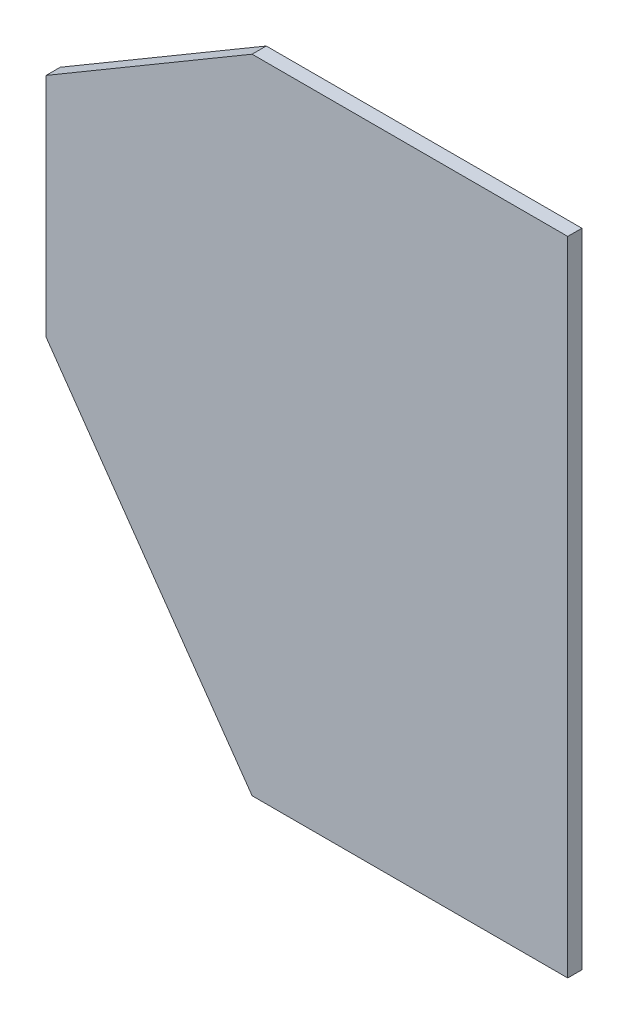
ISO-10303-21;
HEADER;
FILE_DESCRIPTION(('STEP AP214'),'2;1');
FILE_NAME('part.step','',(''),(''),'','','');
FILE_SCHEMA(('AUTOMOTIVE_DESIGN { 1 0 10303 214 1 1 1 1 }'));
ENDSEC;
DATA;
#1=APPLICATION_CONTEXT('core data for automotive mechanical design processes');
#2=APPLICATION_PROTOCOL_DEFINITION('international standard','automotive_design',2000,#1);
#3=PRODUCT_CONTEXT('',#1,'mechanical');
#4=PRODUCT('Part','Part','',(#3));
#5=PRODUCT_RELATED_PRODUCT_CATEGORY('part','',(#4));
#6=PRODUCT_DEFINITION_FORMATION('','',#4);
#7=PRODUCT_DEFINITION_CONTEXT('part definition',#1,'design');
#8=PRODUCT_DEFINITION('design','',#6,#7);
#9=PRODUCT_DEFINITION_SHAPE('','',#8);
#10=(LENGTH_UNIT() NAMED_UNIT(*) SI_UNIT(.MILLI.,.METRE.));
#11=(NAMED_UNIT(*) PLANE_ANGLE_UNIT() SI_UNIT($,.RADIAN.));
#12=(NAMED_UNIT(*) SI_UNIT($,.STERADIAN.) SOLID_ANGLE_UNIT());
#13=UNCERTAINTY_MEASURE_WITH_UNIT(LENGTH_MEASURE(1.E-05),#10,'distance_accuracy_value','');
#14=(GEOMETRIC_REPRESENTATION_CONTEXT(3) GLOBAL_UNCERTAINTY_ASSIGNED_CONTEXT((#13)) GLOBAL_UNIT_ASSIGNED_CONTEXT((#10,
#11,#12)) REPRESENTATION_CONTEXT('',''));
#15=CARTESIAN_POINT('',(0.,0.,0.));
#16=DIRECTION('',(0.,0.,1.));
#17=DIRECTION('',(1.,0.,0.));
#18=AXIS2_PLACEMENT_3D('',#15,#16,#17);
#19=CARTESIAN_POINT('',(-4.28095093104464,229.447181153847,9.525));
#20=DIRECTION('',(-1.,0.,0.));
#21=DIRECTION('',(0.,0.,1.));
#22=AXIS2_PLACEMENT_3D('',#19,#20,#21);
#23=PLANE('',#22);
#24=DIRECTION('',(0.,1.,0.));
#25=VECTOR('',#24,1.);
#26=CARTESIAN_POINT('',(-4.28095093104464,229.447181153847,0.));
#27=LINE('',#26,#25);
#28=CARTESIAN_POINT('',(-4.28095093104464,-202.352818846153,0.));
#29=VERTEX_POINT('',#28);
#30=CARTESIAN_POINT('',(-4.28095093104464,229.447181153847,0.));
#31=VERTEX_POINT('',#30);
#32=EDGE_CURVE('E117',#29,#31,#27,.T.);
#33=ORIENTED_EDGE('',*,*,#32,.T.);
#34=DIRECTION('',(0.,0.,-1.));
#35=VECTOR('',#34,1.);
#36=CARTESIAN_POINT('',(-4.28095093104464,229.447181153847,9.525));
#37=LINE('',#36,#35);
#38=CARTESIAN_POINT('',(-4.28095093104464,229.447181153847,9.525));
#39=VERTEX_POINT('',#38);
#40=EDGE_CURVE('E11',#39,#31,#37,.T.);
#41=ORIENTED_EDGE('',*,*,#40,.F.);
#42=DIRECTION('',(0.,1.,0.));
#43=VECTOR('',#42,1.);
#44=CARTESIAN_POINT('',(-4.28095093104464,229.447181153847,9.525));
#45=LINE('',#44,#43);
#46=CARTESIAN_POINT('',(-4.28095093104464,-202.352818846153,9.525));
#47=VERTEX_POINT('',#46);
#48=EDGE_CURVE('E127',#47,#39,#45,.T.);
#49=ORIENTED_EDGE('',*,*,#48,.F.);
#50=DIRECTION('',(0.,0.,-1.));
#51=VECTOR('',#50,1.);
#52=CARTESIAN_POINT('',(-4.28095093104464,-202.352818846153,9.525));
#53=LINE('',#52,#51);
#54=EDGE_CURVE('E113',#47,#29,#53,.T.);
#55=ORIENTED_EDGE('',*,*,#54,.T.);
#56=EDGE_LOOP('',(#33,#41,#49,#55));
#57=FACE_BOUND('',#56,.T.);
#58=ADVANCED_FACE('F33',(#57),#23,.F.);
#59=CARTESIAN_POINT('',(-216.488062196188,229.447181153847,9.525));
#60=DIRECTION('',(0.,-1.,0.));
#61=DIRECTION('',(0.,0.,-1.));
#62=AXIS2_PLACEMENT_3D('',#59,#60,#61);
#63=PLANE('',#62);
#64=DIRECTION('',(-1.,0.,0.));
#65=VECTOR('',#64,1.);
#66=CARTESIAN_POINT('',(-216.488062196188,229.447181153847,0.));
#67=LINE('',#66,#65);
#68=CARTESIAN_POINT('',(-216.488062196188,229.447181153847,0.));
#69=VERTEX_POINT('',#68);
#70=EDGE_CURVE('E120',#31,#69,#67,.T.);
#71=ORIENTED_EDGE('',*,*,#70,.T.);
#72=DIRECTION('',(0.,0.,-1.));
#73=VECTOR('',#72,1.);
#74=CARTESIAN_POINT('',(-216.488062196188,229.447181153847,9.525));
#75=LINE('',#74,#73);
#76=CARTESIAN_POINT('',(-216.488062196188,229.447181153847,9.525));
#77=VERTEX_POINT('',#76);
#78=EDGE_CURVE('E41',#77,#69,#75,.T.);
#79=ORIENTED_EDGE('',*,*,#78,.F.);
#80=DIRECTION('',(-1.,0.,0.));
#81=VECTOR('',#80,1.);
#82=CARTESIAN_POINT('',(-216.488062196188,229.447181153847,9.525));
#83=LINE('',#82,#81);
#84=EDGE_CURVE('E86',#39,#77,#83,.T.);
#85=ORIENTED_EDGE('',*,*,#84,.F.);
#86=ORIENTED_EDGE('',*,*,#40,.T.);
#87=EDGE_LOOP('',(#71,#79,#85,#86));
#88=FACE_BOUND('',#87,.T.);
#89=ADVANCED_FACE('F151',(#88),#63,.F.);
#90=CARTESIAN_POINT('',(-216.488062196188,229.447181153847,9.525));
#91=DIRECTION('',(0.507640137865777,-0.861569202343964,0.));
#92=DIRECTION('',(0.861569202343964,0.507640137865777,0.));
#93=AXIS2_PLACEMENT_3D('',#90,#91,#92);
#94=PLANE('',#93);
#95=DIRECTION('',(-0.861569202343964,-0.507640137865777,0.));
#96=VECTOR('',#95,1.);
#97=CARTESIAN_POINT('',(-216.488062196188,229.447181153847,0.));
#98=LINE('',#97,#96);
#99=CARTESIAN_POINT('',(-354.995654442996,147.837934871207,0.));
#100=VERTEX_POINT('',#99);
#101=EDGE_CURVE('E122',#69,#100,#98,.T.);
#102=ORIENTED_EDGE('',*,*,#101,.T.);
#103=DIRECTION('',(0.,0.,-1.));
#104=VECTOR('',#103,1.);
#105=CARTESIAN_POINT('',(-354.995654442996,147.837934871207,9.525));
#106=LINE('',#105,#104);
#107=CARTESIAN_POINT('',(-354.995654442996,147.837934871207,9.525));
#108=VERTEX_POINT('',#107);
#109=EDGE_CURVE('E108',#108,#100,#106,.T.);
#110=ORIENTED_EDGE('',*,*,#109,.F.);
#111=DIRECTION('',(-0.861569202343964,-0.507640137865777,0.));
#112=VECTOR('',#111,1.);
#113=CARTESIAN_POINT('',(-216.488062196188,229.447181153847,9.525));
#114=LINE('',#113,#112);
#115=EDGE_CURVE('E99',#77,#108,#114,.T.);
#116=ORIENTED_EDGE('',*,*,#115,.F.);
#117=ORIENTED_EDGE('',*,*,#78,.T.);
#118=EDGE_LOOP('',(#102,#110,#116,#117));
#119=FACE_BOUND('',#118,.T.);
#120=ADVANCED_FACE('F133',(#119),#94,.F.);
#121=CARTESIAN_POINT('',(-354.995654442996,147.837934871207,9.525));
#122=DIRECTION('',(1.,0.,0.));
#123=DIRECTION('',(0.,0.,-1.));
#124=AXIS2_PLACEMENT_3D('',#121,#122,#123);
#125=PLANE('',#124);
#126=DIRECTION('',(0.,-1.,0.));
#127=VECTOR('',#126,1.);
#128=CARTESIAN_POINT('',(-354.995654442996,147.837934871207,0.));
#129=LINE('',#128,#127);
#130=CARTESIAN_POINT('',(-354.995654442996,-4.56206512879289,0.));
#131=VERTEX_POINT('',#130);
#132=EDGE_CURVE('E107',#100,#131,#129,.T.);
#133=ORIENTED_EDGE('',*,*,#132,.T.);
#134=DIRECTION('',(0.,0.,-1.));
#135=VECTOR('',#134,1.);
#136=CARTESIAN_POINT('',(-354.995654442996,-4.56206512879289,9.525));
#137=LINE('',#136,#135);
#138=CARTESIAN_POINT('',(-354.995654442996,-4.56206512879289,9.525));
#139=VERTEX_POINT('',#138);
#140=EDGE_CURVE('E104',#139,#131,#137,.T.);
#141=ORIENTED_EDGE('',*,*,#140,.F.);
#142=DIRECTION('',(0.,-1.,0.));
#143=VECTOR('',#142,1.);
#144=CARTESIAN_POINT('',(-354.995654442996,147.837934871207,9.525));
#145=LINE('',#144,#143);
#146=EDGE_CURVE('E93',#108,#139,#145,.T.);
#147=ORIENTED_EDGE('',*,*,#146,.F.);
#148=ORIENTED_EDGE('',*,*,#109,.T.);
#149=EDGE_LOOP('',(#133,#141,#147,#148));
#150=FACE_BOUND('',#149,.T.);
#151=ADVANCED_FACE('F105',(#150),#125,.F.);
#152=CARTESIAN_POINT('',(-354.995654442996,-4.56206512879289,9.525));
#153=DIRECTION('',(0.819126717760353,0.573612604682944,0.));
#154=DIRECTION('',(-0.573612604682944,0.819126717760353,0.));
#155=AXIS2_PLACEMENT_3D('',#152,#153,#154);
#156=PLANE('',#155);
#157=DIRECTION('',(0.573612604682944,-0.819126717760353,0.));
#158=VECTOR('',#157,1.);
#159=CARTESIAN_POINT('',(-354.995654442996,-4.56206512879289,0.));
#160=LINE('',#159,#158);
#161=CARTESIAN_POINT('',(-216.488062196188,-202.352818846153,0.));
#162=VERTEX_POINT('',#161);
#163=EDGE_CURVE('E72',#131,#162,#160,.T.);
#164=ORIENTED_EDGE('',*,*,#163,.T.);
#165=DIRECTION('',(0.,0.,-1.));
#166=VECTOR('',#165,1.);
#167=CARTESIAN_POINT('',(-216.488062196188,-202.352818846153,9.525));
#168=LINE('',#167,#166);
#169=CARTESIAN_POINT('',(-216.488062196188,-202.352818846153,9.525));
#170=VERTEX_POINT('',#169);
#171=EDGE_CURVE('E109',#170,#162,#168,.T.);
#172=ORIENTED_EDGE('',*,*,#171,.F.);
#173=DIRECTION('',(0.573612604682944,-0.819126717760353,0.));
#174=VECTOR('',#173,1.);
#175=CARTESIAN_POINT('',(-354.995654442996,-4.56206512879289,9.525));
#176=LINE('',#175,#174);
#177=EDGE_CURVE('E97',#139,#170,#176,.T.);
#178=ORIENTED_EDGE('',*,*,#177,.F.);
#179=ORIENTED_EDGE('',*,*,#140,.T.);
#180=EDGE_LOOP('',(#164,#172,#178,#179));
#181=FACE_BOUND('',#180,.T.);
#182=ADVANCED_FACE('F111',(#181),#156,.F.);
#183=CARTESIAN_POINT('',(-4.28095093104464,-202.352818846153,9.525));
#184=DIRECTION('',(0.,1.,0.));
#185=DIRECTION('',(0.,0.,1.));
#186=AXIS2_PLACEMENT_3D('',#183,#184,#185);
#187=PLANE('',#186);
#188=DIRECTION('',(1.,0.,0.));
#189=VECTOR('',#188,1.);
#190=CARTESIAN_POINT('',(-4.28095093104464,-202.352818846153,0.));
#191=LINE('',#190,#189);
#192=EDGE_CURVE('E78',#162,#29,#191,.T.);
#193=ORIENTED_EDGE('',*,*,#192,.T.);
#194=ORIENTED_EDGE('',*,*,#54,.F.);
#195=DIRECTION('',(1.,0.,0.));
#196=VECTOR('',#195,1.);
#197=CARTESIAN_POINT('',(-4.28095093104464,-202.352818846153,9.525));
#198=LINE('',#197,#196);
#199=EDGE_CURVE('E49',#170,#47,#198,.T.);
#200=ORIENTED_EDGE('',*,*,#199,.F.);
#201=ORIENTED_EDGE('',*,*,#171,.T.);
#202=EDGE_LOOP('',(#193,#194,#200,#201));
#203=FACE_BOUND('',#202,.T.);
#204=ADVANCED_FACE('F140',(#203),#187,.F.);
#205=CARTESIAN_POINT('',(0.,0.,9.525));
#206=DIRECTION('',(0.,0.,-1.));
#207=DIRECTION('',(-1.,0.,0.));
#208=AXIS2_PLACEMENT_3D('',#205,#206,#207);
#209=PLANE('',#208);
#210=ORIENTED_EDGE('',*,*,#48,.T.);
#211=ORIENTED_EDGE('',*,*,#84,.T.);
#212=ORIENTED_EDGE('',*,*,#115,.T.);
#213=ORIENTED_EDGE('',*,*,#146,.T.);
#214=ORIENTED_EDGE('',*,*,#177,.T.);
#215=ORIENTED_EDGE('',*,*,#199,.T.);
#216=EDGE_LOOP('',(#210,#211,#212,#213,#214,#215));
#217=FACE_BOUND('',#216,.T.);
#218=ADVANCED_FACE('F95',(#217),#209,.F.);
#219=CARTESIAN_POINT('',(0.,0.,0.));
#220=DIRECTION('',(0.,0.,-1.));
#221=DIRECTION('',(-1.,0.,0.));
#222=AXIS2_PLACEMENT_3D('',#219,#220,#221);
#223=PLANE('',#222);
#224=ORIENTED_EDGE('',*,*,#32,.F.);
#225=ORIENTED_EDGE('',*,*,#192,.F.);
#226=ORIENTED_EDGE('',*,*,#163,.F.);
#227=ORIENTED_EDGE('',*,*,#132,.F.);
#228=ORIENTED_EDGE('',*,*,#101,.F.);
#229=ORIENTED_EDGE('',*,*,#70,.F.);
#230=EDGE_LOOP('',(#224,#225,#226,#227,#228,#229));
#231=FACE_BOUND('',#230,.T.);
#232=ADVANCED_FACE('F136',(#231),#223,.T.);
#233=CLOSED_SHELL('',(#58,#89,#120,#151,#182,#204,#218,#232));
#234=MANIFOLD_SOLID_BREP('B2',#233);
#235=ADVANCED_BREP_SHAPE_REPRESENTATION('',(#18,#234),#14);
#236=SHAPE_DEFINITION_REPRESENTATION(#9,#235);
ENDSEC;
END-ISO-10303-21;
